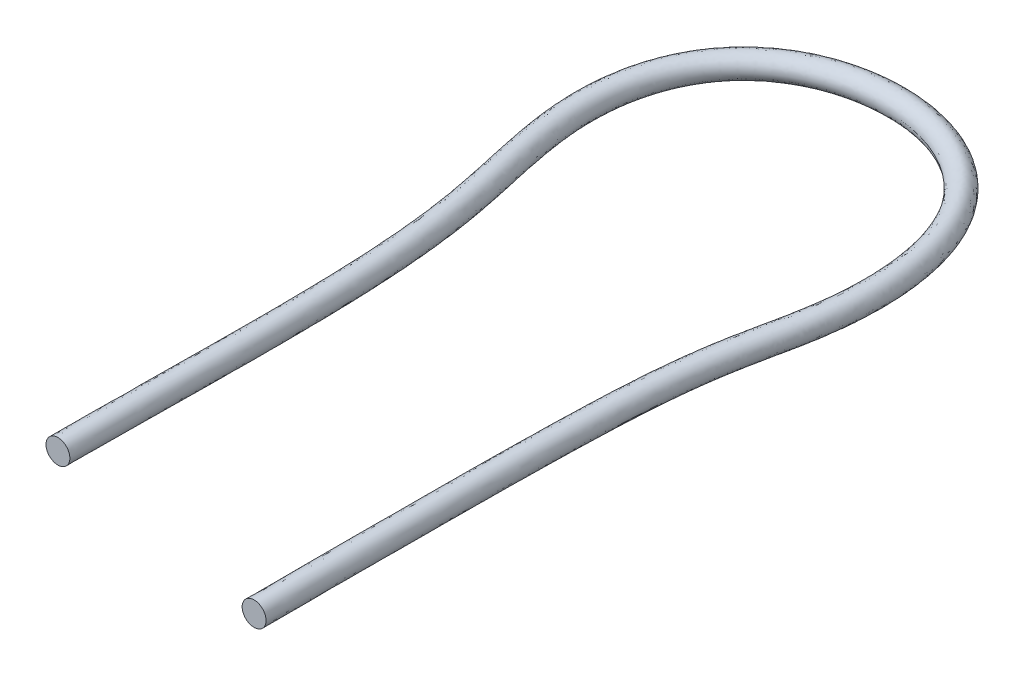
ISO-10303-21;
HEADER;
FILE_DESCRIPTION(('STEP AP214'),'2;1');
FILE_NAME('part.step','',(''),(''),'','','');
FILE_SCHEMA(('AUTOMOTIVE_DESIGN { 1 0 10303 214 1 1 1 1 }'));
ENDSEC;
DATA;
#1=APPLICATION_CONTEXT('core data for automotive mechanical design processes');
#2=APPLICATION_PROTOCOL_DEFINITION('international standard','automotive_design',2000,#1);
#3=PRODUCT_CONTEXT('',#1,'mechanical');
#4=PRODUCT('Part','Part','',(#3));
#5=PRODUCT_RELATED_PRODUCT_CATEGORY('part','',(#4));
#6=PRODUCT_DEFINITION_FORMATION('','',#4);
#7=PRODUCT_DEFINITION_CONTEXT('part definition',#1,'design');
#8=PRODUCT_DEFINITION('design','',#6,#7);
#9=PRODUCT_DEFINITION_SHAPE('','',#8);
#10=(LENGTH_UNIT() NAMED_UNIT(*) SI_UNIT(.MILLI.,.METRE.));
#11=(NAMED_UNIT(*) PLANE_ANGLE_UNIT() SI_UNIT($,.RADIAN.));
#12=(NAMED_UNIT(*) SI_UNIT($,.STERADIAN.) SOLID_ANGLE_UNIT());
#13=UNCERTAINTY_MEASURE_WITH_UNIT(LENGTH_MEASURE(1.E-05),#10,'distance_accuracy_value','');
#14=(GEOMETRIC_REPRESENTATION_CONTEXT(3) GLOBAL_UNCERTAINTY_ASSIGNED_CONTEXT((#13)) GLOBAL_UNIT_ASSIGNED_CONTEXT((#10,
#11,#12)) REPRESENTATION_CONTEXT('',''));
#15=CARTESIAN_POINT('',(0.,0.,0.));
#16=DIRECTION('',(0.,0.,1.));
#17=DIRECTION('',(1.,0.,0.));
#18=AXIS2_PLACEMENT_3D('',#15,#16,#17);
#19=CARTESIAN_POINT('',(0.,0.,0.));
#20=DIRECTION('',(0.,0.,1.));
#21=DIRECTION('',(1.,0.,0.));
#22=AXIS2_PLACEMENT_3D('',#19,#20,#21);
#23=PLANE('',#22);
#24=CARTESIAN_POINT('',(1.35098710010471,1.96404247382822E-07,0.));
#25=CARTESIAN_POINT('',(1.35099928413305,-0.0761665200162625,0.));
#26=CARTESIAN_POINT('',(1.344074112499,-0.152390199336861,0.));
#27=CARTESIAN_POINT('',(1.31741873550504,-0.302673851011979,0.));
#28=CARTESIAN_POINT('',(1.29765653922463,-0.376727933392834,0.));
#29=CARTESIAN_POINT('',(1.24645848200623,-0.520400145417849,0.));
#30=CARTESIAN_POINT('',(1.21505994685638,-0.590031633767595,0.));
#31=CARTESIAN_POINT('',(1.14143734353301,-0.723305068133596,0.));
#32=CARTESIAN_POINT('',(1.09922166495355,-0.786951603917261,0.));
#33=CARTESIAN_POINT('',(1.02758440520029,-0.877490887674194,0.));
#34=CARTESIAN_POINT('',(1.00179772976689,-0.907317680802031,0.));
#35=CARTESIAN_POINT('',(0.947658220601305,-0.964555548310392,0.));
#36=CARTESIAN_POINT('',(0.919305700549644,-0.991966917175691,0.));
#37=CARTESIAN_POINT('',(0.860182318544872,-1.04401135085076,0.));
#38=CARTESIAN_POINT('',(0.82941293765561,-1.06864609499499,0.));
#39=CARTESIAN_POINT('',(0.765716136219022,-1.11492808019237,0.));
#40=CARTESIAN_POINT('',(0.732788628743499,-1.1365752007964,0.));
#41=CARTESIAN_POINT('',(0.636493999470526,-1.19385628663197,0.));
#42=CARTESIAN_POINT('',(0.570918236945154,-1.22585096379896,0.));
#43=CARTESIAN_POINT('',(0.435530974968001,-1.27914859571307,0.));
#44=CARTESIAN_POINT('',(0.365713887904819,-1.30043708785731,0.));
#45=CARTESIAN_POINT('',(0.219353219383041,-1.33292795791501,0.));
#46=CARTESIAN_POINT('',(0.142656261752704,-1.34345741834728,0.));
#47=CARTESIAN_POINT('',(0.0272234662749047,-1.34958750423538,0.));
#48=CARTESIAN_POINT('',(-0.0113119422936278,-1.35002094808346,0.));
#49=CARTESIAN_POINT('',(-0.0882888618679696,-1.34760127351201,0.));
#50=CARTESIAN_POINT('',(-0.126730379590848,-1.34474839753818,0.));
#51=CARTESIAN_POINT('',(-0.203438663783841,-1.33566012733553,0.));
#52=CARTESIAN_POINT('',(-0.241703136765083,-1.3294052820221,0.));
#53=CARTESIAN_POINT('',(-0.317498780159154,-1.31341786117966,0.));
#54=CARTESIAN_POINT('',(-0.355029966593961,-1.30368536172563,0.));
#55=CARTESIAN_POINT('',(-0.429087925986064,-1.28090048703711,0.));
#56=CARTESIAN_POINT('',(-0.465614222245975,-1.26784656529133,0.));
#57=CARTESIAN_POINT('',(-0.537395351784267,-1.23863736423961,0.));
#58=CARTESIAN_POINT('',(-0.572650078331017,-1.2224818253098,0.));
#59=CARTESIAN_POINT('',(-0.672717801167074,-1.1714049060049,0.));
#60=CARTESIAN_POINT('',(-0.735629496001078,-1.13266426922994,0.));
#61=CARTESIAN_POINT('',(-0.854643483506827,-1.04587385293271,0.));
#62=CARTESIAN_POINT('',(-0.910741974396287,-0.99781891447826,0.));
#63=CARTESIAN_POINT('',(-1.01840626283315,-0.889672696062223,0.));
#64=CARTESIAN_POINT('',(-1.0693665644763,-0.828968713241499,0.));
#65=CARTESIAN_POINT('',(-1.13706488934229,-0.731966154861296,0.));
#66=CARTESIAN_POINT('',(-1.15817081187796,-0.698647732197779,0.));
#67=CARTESIAN_POINT('',(-1.19720799326092,-0.630203008487769,0.));
#68=CARTESIAN_POINT('',(-1.21513999283739,-0.595077131740842,0.));
#69=CARTESIAN_POINT('',(-1.26193518866379,-0.491602042092125,0.));
#70=CARTESIAN_POINT('',(-1.28649628695393,-0.421266337043056,0.));
#71=CARTESIAN_POINT('',(-1.32368283918677,-0.27750174627689,0.));
#72=CARTESIAN_POINT('',(-1.33629885568252,-0.204070462596971,0.));
#73=CARTESIAN_POINT('',(-1.3464056283475,-0.0928659527308167,0.));
#74=CARTESIAN_POINT('',(-1.34829296343418,-0.0554459596331201,0.));
#75=CARTESIAN_POINT('',(-1.34908210368954,0.0193754247597944,0.));
#76=CARTESIAN_POINT('',(-1.34798751615738,0.056776783835183,0.));
#77=CARTESIAN_POINT('',(-1.34022911032843,0.168689489718033,0.));
#78=CARTESIAN_POINT('',(-1.32909562088423,0.242964804204473,0.));
#79=CARTESIAN_POINT('',(-1.30298447934316,0.354109187614443,0.));
#80=CARTESIAN_POINT('',(-1.29231623984545,0.392053322124934,0.));
#81=CARTESIAN_POINT('',(-1.26765597855355,0.46685556777208,0.));
#82=CARTESIAN_POINT('',(-1.2536645677412,0.503713877144637,0.));
#83=CARTESIAN_POINT('',(-1.22234116743374,0.57596605623887,0.));
#84=CARTESIAN_POINT('',(-1.20501058877813,0.611360536801727,0.));
#85=CARTESIAN_POINT('',(-1.1671797779008,0.68040232627059,0.));
#86=CARTESIAN_POINT('',(-1.14667931404922,0.7140495072577,0.));
#87=CARTESIAN_POINT('',(-1.08376083084938,0.807719104267566,0.));
#88=CARTESIAN_POINT('',(-1.03773051916774,0.865362974183513,0.));
#89=CARTESIAN_POINT('',(-0.937157279356102,0.972711357206334,0.));
#90=CARTESIAN_POINT('',(-0.882603235603041,1.02240532929103,0.));
#91=CARTESIAN_POINT('',(-0.762976948502769,1.11535086198843,0.));
#92=CARTESIAN_POINT('',(-0.697477527491923,1.15805971721893,0.));
#93=CARTESIAN_POINT('',(-0.594636222597143,1.21329234373315,0.));
#94=CARTESIAN_POINT('',(-0.559599632908965,1.23022835389675,0.));
#95=CARTESIAN_POINT('',(-0.488174725722348,1.26098314389959,0.));
#96=CARTESIAN_POINT('',(-0.451786570505452,1.27480229657764,0.));
#97=CARTESIAN_POINT('',(-0.378369229066446,1.29895490145853,0.));
#98=CARTESIAN_POINT('',(-0.341353576533954,1.30932943086708,0.));
#99=CARTESIAN_POINT('',(-0.26652233995772,1.32661721559541,0.));
#100=CARTESIAN_POINT('',(-0.228706757760258,1.33353047890308,0.));
#101=CARTESIAN_POINT('',(-0.152590403996903,1.34395987245995,0.));
#102=CARTESIAN_POINT('',(-0.11428936720742,1.34747405676379,0.));
#103=CARTESIAN_POINT('',(-0.037535848025708,1.35118503605179,0.));
#104=CARTESIAN_POINT('',(0.000916644640933498,1.35138160196009,0.));
#105=CARTESIAN_POINT('',(0.11204508692799,1.34726613108592,0.));
#106=CARTESIAN_POINT('',(0.18460720224646,1.33876954216588,0.));
#107=CARTESIAN_POINT('',(0.327526593284278,1.31069317476766,0.));
#108=CARTESIAN_POINT('',(0.397882886069197,1.29110852739953,0.));
#109=CARTESIAN_POINT('',(0.540302934990082,1.23916693300475,0.));
#110=CARTESIAN_POINT('',(0.612045031153789,1.20590555490946,0.));
#111=CARTESIAN_POINT('',(0.714338333614083,1.14701313541189,0.));
#112=CARTESIAN_POINT('',(0.747546224886277,1.12588498466891,0.));
#113=CARTESIAN_POINT('',(0.811883689442075,1.0806741183461,0.));
#114=CARTESIAN_POINT('',(0.843013639379242,1.05659194047963,0.));
#115=CARTESIAN_POINT('',(0.929795488968784,0.982751318619446,0.));
#116=CARTESIAN_POINT('',(0.982393344836369,0.929339564763248,0.));
#117=CARTESIAN_POINT('',(1.07812048705414,0.814574417858545,0.));
#118=CARTESIAN_POINT('',(1.1212352942273,0.75320910485345,0.));
#119=CARTESIAN_POINT('',(1.19759562387719,0.623672844167406,0.));
#120=CARTESIAN_POINT('',(1.23072250973091,0.555432026639248,0.));
#121=CARTESIAN_POINT('',(1.28553298306528,0.414593155221956,0.));
#122=CARTESIAN_POINT('',(1.30723633389997,0.342002870188013,0.));
#123=CARTESIAN_POINT('',(1.33200980689864,0.224081504146302,0.));
#124=CARTESIAN_POINT('',(1.33906440971004,0.179557272547904,0.));
#125=CARTESIAN_POINT('',(1.3485485726401,0.0900286010506202,0.));
#126=CARTESIAN_POINT('',(1.35097989780427,0.0450243510115035,0.));
#127=CARTESIAN_POINT('',(1.35098710010471,1.96404247382822E-07,0.));
#128=B_SPLINE_CURVE_WITH_KNOTS('',3,(#24,#25,#26,#27,#28,#29,#30,#31,#32,#33,#34,#35,#36,#37,
#38,#39,#40,#41,#42,#43,#44,#45,#46,#47,#48,#49,#50,#51,#52,#53,#54,#55,#56,#57,#58,#59,#60,#61,
#62,#63,#64,#65,#66,#67,#68,#69,#70,#71,#72,#73,#74,#75,#76,#77,#78,#79,#80,#81,#82,#83,#84,#85,
#86,#87,#88,#89,#90,#91,#92,#93,#94,#95,#96,#97,#98,#99,#100,#101,#102,#103,#104,#105,#106,#107,
#108,#109,#110,#111,#112,#113,#114,#115,#116,#117,#118,#119,#120,#121,#122,#123,#124,#125,#126,
#127),.UNSPECIFIED.,.T.,.F.,(4,2,2,2,2,2,2,2,2,2,2,2,2,2,2,2,2,2,2,2,2,2,2,2,2,2,2,2,2,2,2,2,2,
2,2,2,2,2,2,2,2,2,2,2,2,2,2,2,2,2,2,4),(0.,0.228335747141374,0.457242720191214,
0.685421697455897,0.913424235809351,1.0315790428782,1.14971942470782,1.26778796605593,
1.38586126606857,1.60371479377741,1.82186182681172,2.05294411636614,2.16844500868064,
2.28393738055188,2.4000971410733,2.51625436071202,2.63246576443929,2.74868689999926,
2.96932648965598,3.19008863646075,3.42654047263579,3.54472171289959,3.6628753355894,
3.88520437482614,4.10770892328014,4.22000485097235,4.33216499208749,4.55632036450323,
4.67444651617215,4.79255096653997,4.91060562531882,5.0286689146689,5.24892167417752,
5.469464095703,5.70283183207177,5.81945818290032,5.93607057546547,6.0512377404041,
6.16640463955963,6.28163743188262,6.39687818080026,6.61506730211288,6.83335230709072,
7.06928133818111,7.18722087085101,7.3051389670846,7.52884011520056,7.75288048585349,
7.97948572364939,8.20569762231183,8.34072446375077,8.475699745144),.UNSPECIFIED.);
#129=CARTESIAN_POINT('',(1.35098710010471,1.96404247382822E-07,0.));
#130=VERTEX_POINT('',#129);
#131=EDGE_CURVE('E22',#130,#130,#128,.T.);
#132=ORIENTED_EDGE('',*,*,#131,.F.);
#133=EDGE_LOOP('',(#132));
#134=FACE_BOUND('',#133,.T.);
#135=ADVANCED_FACE('F15',(#134),#23,.T.);
#136=CARTESIAN_POINT('',(27.,0.,4.80621192690123));
#137=DIRECTION('',(0.,0.,-1.));
#138=DIRECTION('',(-1.,0.,0.));
#139=AXIS2_PLACEMENT_3D('',#136,#137,#138);
#140=PLANE('',#139);
#141=CARTESIAN_POINT('',(25.6490128998951,1.96404247382822E-07,4.8062119269012));
#142=CARTESIAN_POINT('',(25.6490310916167,0.0760096669256623,4.80621192690119));
#143=CARTESIAN_POINT('',(25.6559584808471,0.152073013553381,4.80621192690123));
#144=CARTESIAN_POINT('',(25.6825998074527,0.302032717457189,4.80621192690123));
#145=CARTESIAN_POINT('',(25.7023449171346,0.375923331567917,4.8062119269012));
#146=CARTESIAN_POINT('',(25.7534933145616,0.51926888387716,4.8062119269012));
#147=CARTESIAN_POINT('',(25.7848593823699,0.588737162562841,4.80621192690123));
#148=CARTESIAN_POINT('',(25.8583803873003,0.721698252225705,4.80621192690123));
#149=CARTESIAN_POINT('',(25.900527291278,0.78519546446237,4.8062119269012));
#150=CARTESIAN_POINT('',(25.9720340926442,0.875583652835084,4.80621192690121));
#151=CARTESIAN_POINT('',(25.9977873244021,0.905386099630092,4.80621192690123));
#152=CARTESIAN_POINT('',(26.0518426123432,0.962594062648999,4.80621192690124));
#153=CARTESIAN_POINT('',(26.0801443772195,0.989999852115738,4.80621192690123));
#154=CARTESIAN_POINT('',(26.1391462953624,1.04206547268356,4.80621192690123));
#155=CARTESIAN_POINT('',(26.1698451151574,1.06672681225067,4.80621192690123));
#156=CARTESIAN_POINT('',(26.2333837254156,1.11309873578892,4.80621192690123));
#157=CARTESIAN_POINT('',(26.2662236064603,1.13480919479746,4.80621192690123));
#158=CARTESIAN_POINT('',(26.3627528993106,1.19262245596736,4.80621192690122));
#159=CARTESIAN_POINT('',(26.4286889584514,1.22504958114553,4.80621192690123));
#160=CARTESIAN_POINT('',(26.5648654634794,1.27914589561617,4.80621192690123));
#161=CARTESIAN_POINT('',(26.6351117006421,1.3008002382684,4.80621192690123));
#162=CARTESIAN_POINT('',(26.7823706454491,1.33389682185152,4.80621192690123));
#163=CARTESIAN_POINT('',(26.8595387167118,1.34466689408763,4.80621192690123));
#164=CARTESIAN_POINT('',(26.9756955429293,1.35098144210065,4.80621192690123));
#165=CARTESIAN_POINT('',(27.014473149443,1.35144720141041,4.80621192690123));
#166=CARTESIAN_POINT('',(27.091932443632,1.34902017307044,4.80621192690123));
#167=CARTESIAN_POINT('',(27.1306141399608,1.34612770035049,4.80621192690123));
#168=CARTESIAN_POINT('',(27.2073509035398,1.3369268434792,4.80621192690123));
#169=CARTESIAN_POINT('',(27.2454082687886,1.33063771369071,4.80621192690123));
#170=CARTESIAN_POINT('',(27.3207783134108,1.31456624632564,4.80621192690123));
#171=CARTESIAN_POINT('',(27.3580910128585,1.30478400304886,4.80621192690123));
#172=CARTESIAN_POINT('',(27.4316982552404,1.28189410695894,4.80621192690123));
#173=CARTESIAN_POINT('',(27.4679923294074,1.2687849501035,4.80621192690123));
#174=CARTESIAN_POINT('',(27.5392961689603,1.23946594349148,4.80621192690123));
#175=CARTESIAN_POINT('',(27.5743058248294,1.22325583005835,4.80621192690123));
#176=CARTESIAN_POINT('',(27.6731366525951,1.17229879314828,4.80621192690123));
#177=CARTESIAN_POINT('',(27.7350834465837,1.13382830900856,4.80621192690123));
#178=CARTESIAN_POINT('',(27.8522938106196,1.04781452903272,4.80621192690123));
#179=CARTESIAN_POINT('',(27.9075536458451,1.00026620087433,4.80621192690123));
#180=CARTESIAN_POINT('',(28.0142802259861,0.892898039628792,4.80621192690123));
#181=CARTESIAN_POINT('',(28.0650683448158,0.832393047541259,4.80621192690123));
#182=CARTESIAN_POINT('',(28.1326887035602,0.735791773365219,4.80621192690123));
#183=CARTESIAN_POINT('',(28.1537997010541,0.702621998780522,4.80621192690123));
#184=CARTESIAN_POINT('',(28.1929269816526,0.634507218018846,4.80621192690123));
#185=CARTESIAN_POINT('',(28.2109439329851,0.599562597277077,4.80621192690123));
#186=CARTESIAN_POINT('',(28.258590903843,0.495559045700699,4.80621192690123));
#187=CARTESIAN_POINT('',(28.2838317596035,0.4244455810599,4.80621192690123));
#188=CARTESIAN_POINT('',(28.3222151569606,0.279019383845597,4.80621192690123));
#189=CARTESIAN_POINT('',(28.3353487716641,0.204704332873248,4.80621192690123));
#190=CARTESIAN_POINT('',(28.3460435011613,0.0921837539038651,4.80621192690123));
#191=CARTESIAN_POINT('',(28.3480980467719,0.0543587413367732,4.80621192690123));
#192=CARTESIAN_POINT('',(28.3491574529029,-0.0212834349510286,4.80621192690123));
#193=CARTESIAN_POINT('',(28.3481659621983,-0.0591005538369505,4.80621192690123));
#194=CARTESIAN_POINT('',(28.3406006042982,-0.17225972599138,4.80621192690123));
#195=CARTESIAN_POINT('',(28.3294419966448,-0.247374518923354,4.80621192690123));
#196=CARTESIAN_POINT('',(28.3031086363308,-0.359187874747676,4.80621192690123));
#197=CARTESIAN_POINT('',(28.2924357003579,-0.397012631079278,4.80621192690123));
#198=CARTESIAN_POINT('',(28.2677375396411,-0.471561233730864,4.80621192690123));
#199=CARTESIAN_POINT('',(28.2537130013909,-0.508285303768222,4.80621192690123));
#200=CARTESIAN_POINT('',(28.2222884231738,-0.580240410836423,4.80621192690123));
#201=CARTESIAN_POINT('',(28.2048900117672,-0.615472158250492,4.80621192690123));
#202=CARTESIAN_POINT('',(28.166903869564,-0.684161626498545,4.80621192690123));
#203=CARTESIAN_POINT('',(28.1463158771374,-0.717619201501017,4.80621192690123));
#204=CARTESIAN_POINT('',(28.083624099987,-0.809989012762379,4.80621192690123));
#205=CARTESIAN_POINT('',(28.0380190061137,-0.866569643807972,4.80621192690123));
#206=CARTESIAN_POINT('',(27.9385290269561,-0.971943652174595,4.80621192690123));
#207=CARTESIAN_POINT('',(27.8846334150817,-1.02072677161844,4.80621192690123));
#208=CARTESIAN_POINT('',(27.7660892473747,-1.11247297480754,4.80621192690123));
#209=CARTESIAN_POINT('',(27.7009613790715,-1.15482430748371,4.80621192690123));
#210=CARTESIAN_POINT('',(27.598775483529,-1.20971708455336,4.80621192690123));
#211=CARTESIAN_POINT('',(27.5639711839238,-1.22657337819676,4.80621192690123));
#212=CARTESIAN_POINT('',(27.4930392705512,-1.25724869251104,4.80621192690123));
#213=CARTESIAN_POINT('',(27.456911780398,-1.27106799606153,4.80621192690123));
#214=CARTESIAN_POINT('',(27.3834795165454,-1.29550079037458,4.80621192690123));
#215=CARTESIAN_POINT('',(27.3461718605326,-1.30610563470809,4.80621192690123));
#216=CARTESIAN_POINT('',(27.2707405736359,-1.32384832990053,4.80621192690123));
#217=CARTESIAN_POINT('',(27.2326169443932,-1.33098618773172,4.80621192690123));
#218=CARTESIAN_POINT('',(27.1558667760142,-1.34184259890739,4.80621192690123));
#219=CARTESIAN_POINT('',(27.1172399754072,-1.34555929620208,4.80621192690123));
#220=CARTESIAN_POINT('',(27.0398187898485,-1.34964544204758,4.80621192690123));
#221=CARTESIAN_POINT('',(27.0010243935924,-1.35001466116523,4.80621192690123));
#222=CARTESIAN_POINT('',(26.8886714572344,-1.34633284963424,4.80621192690123));
#223=CARTESIAN_POINT('',(26.8152095871757,-1.33801019750407,4.80621192690123));
#224=CARTESIAN_POINT('',(26.6705106651554,-1.31000418532802,4.80621192690123));
#225=CARTESIAN_POINT('',(26.5992745494728,-1.29031611039522,4.80621192690123));
#226=CARTESIAN_POINT('',(26.4560119332881,-1.23813469511415,4.80621192690123));
#227=CARTESIAN_POINT('',(26.384263167647,-1.20485926641245,4.80621192690123));
#228=CARTESIAN_POINT('',(26.2820254880633,-1.14586048798767,4.80621192690123));
#229=CARTESIAN_POINT('',(26.2488485452187,-1.12468392534084,4.80621192690123));
#230=CARTESIAN_POINT('',(26.1845996306126,-1.07934613804822,4.80621192690123));
#231=CARTESIAN_POINT('',(26.1535274171278,-1.05518525704732,4.80621192690122));
#232=CARTESIAN_POINT('',(26.0674712736605,-0.981545237888372,4.80621192690122));
#233=CARTESIAN_POINT('',(26.0154960907648,-0.928489923190905,4.80621192690123));
#234=CARTESIAN_POINT('',(25.9208807832594,-0.814580472507023,4.80621192690123));
#235=CARTESIAN_POINT('',(25.8782553567935,-0.753714292268568,4.8062119269012));
#236=CARTESIAN_POINT('',(25.8024812713937,-0.624950452105059,4.80621192690121));
#237=CARTESIAN_POINT('',(25.7695059463929,-0.556950888168026,4.80621192690124));
#238=CARTESIAN_POINT('',(25.7148532822663,-0.416570175825604,4.80621192690122));
#239=CARTESIAN_POINT('',(25.6931676973267,-0.344192268529782,4.80621192690118));
#240=CARTESIAN_POINT('',(25.6682243699299,-0.22609828616854,4.8062119269012));
#241=CARTESIAN_POINT('',(25.6610697462479,-0.181176646834153,4.80621192690123));
#242=CARTESIAN_POINT('',(25.6514594651112,-0.0908428936334838,4.80621192690123));
#243=CARTESIAN_POINT('',(25.6490020266294,-0.0454309722377617,4.80621192690121));
#244=CARTESIAN_POINT('',(25.6490128998951,1.96404247382822E-07,4.8062119269012));
#245=B_SPLINE_CURVE_WITH_KNOTS('',3,(#141,#142,#143,#144,#145,#146,#147,#148,#149,#150,#151,
#152,#153,#154,#155,#156,#157,#158,#159,#160,#161,#162,#163,#164,#165,#166,#167,#168,#169,#170,
#171,#172,#173,#174,#175,#176,#177,#178,#179,#180,#181,#182,#183,#184,#185,#186,#187,#188,#189,
#190,#191,#192,#193,#194,#195,#196,#197,#198,#199,#200,#201,#202,#203,#204,#205,#206,#207,#208,
#209,#210,#211,#212,#213,#214,#215,#216,#217,#218,#219,#220,#221,#222,#223,#224,#225,#226,#227,
#228,#229,#230,#231,#232,#233,#234,#235,#236,#237,#238,#239,#240,#241,#242,#243,#244),
.UNSPECIFIED.,.T.,.F.,(4,2,2,2,2,2,2,2,2,2,2,2,2,2,2,2,2,2,2,2,2,2,2,2,2,2,2,2,2,2,2,2,2,2,2,2,
2,2,2,2,2,2,2,2,2,2,2,2,2,2,2,4),(0.,0.227862848263208,0.456281938675764,0.683975678709412,
0.911500248619596,1.02953579656502,1.14755786968853,1.26551474909696,1.38347662213643,
1.60286533072648,1.82255556066755,2.05510894366008,2.17133323673229,2.28754663135061,
2.40310806654888,2.51866638229558,2.63427703338684,2.74989751930684,2.96767495375723,
3.18557346598796,3.42127220125251,3.53909144405155,3.65688520908295,3.88207800572412,
4.10743670869172,4.22096869896585,4.33436474500428,4.56096332443142,4.6787465321178,
4.79650563543793,4.91420803758629,5.03192009956081,5.24891395356987,5.46619096139169,
5.6980750912069,5.81397536359762,5.92986483590956,6.04606332293782,6.16226157628486,
6.27852283247769,6.39479205705266,6.61557390579775,6.83644741063857,7.07239197993561,
7.1903278630587,7.30825017847813,7.52990095314295,7.75189771226813,7.97766659038434,
8.20327033899697,8.33951655766317,8.47571110573304),.UNSPECIFIED.);
#246=CARTESIAN_POINT('',(25.6490128998951,1.96404247382822E-07,4.8062119269012));
#247=VERTEX_POINT('',#246);
#248=EDGE_CURVE('E10',#247,#247,#245,.T.);
#249=ORIENTED_EDGE('',*,*,#248,.F.);
#250=EDGE_LOOP('',(#249));
#251=FACE_BOUND('',#250,.T.);
#252=ADVANCED_FACE('F36',(#251),#140,.F.);
#253=CARTESIAN_POINT('',(1.35098712339463,-0.000186764345551631,0.));
#254=CARTESIAN_POINT('',(1.35098712339463,-0.000186764345551631,-4.84270709144785));
#255=CARTESIAN_POINT('',(1.47786088297692,-0.000186764345551631,-14.1794830064112));
#256=CARTESIAN_POINT('',(1.58193377158335,-0.000186764345551631,-26.3674910993353));
#257=CARTESIAN_POINT('',(1.31952752822296,-0.000186764345551631,-36.3596255541261));
#258=CARTESIAN_POINT('',(0.357848237223821,-0.000186764345551631,-46.7895152418183));
#259=CARTESIAN_POINT('',(-1.75716946678794,-0.000186764345551632,-55.2824318096049));
#260=CARTESIAN_POINT('',(-2.94020844999405,-0.000186764345551631,-62.2975754419758));
#261=CARTESIAN_POINT('',(-2.49611525312067,-0.000186764345551631,-67.0777910133066));
#262=CARTESIAN_POINT('',(-1.60505484066426,-0.000186764345551631,-70.7543839365625));
#263=CARTESIAN_POINT('',(0.211957974263065,-0.000186764345551631,-74.5931764181462));
#264=CARTESIAN_POINT('',(4.51461143016742,-0.000186764345551631,-78.4009958570542));
#265=CARTESIAN_POINT('',(10.4672199548498,-0.000186764345551631,-80.4302398279857));
#266=CARTESIAN_POINT('',(17.1063732601853,-0.000186764345551631,-80.2354727814003));
#267=CARTESIAN_POINT('',(22.8200189232497,-0.000186764345551631,-77.7651899750285));
#268=CARTESIAN_POINT('',(26.8266892118166,-0.000186764345551631,-73.3851932844623));
#269=CARTESIAN_POINT('',(28.9647759369274,-0.000186764345551631,-67.57077644598));
#270=CARTESIAN_POINT('',(29.3921976783929,-0.000186764345551631,-62.4449884825942));
#271=CARTESIAN_POINT('',(29.2281477347646,-0.000186764345551631,-58.7215240966603));
#272=CARTESIAN_POINT('',(28.8060614816325,-0.000186764345551631,-55.2107104563111));
#273=CARTESIAN_POINT('',(27.9515338355809,-0.000186764345551631,-51.1590937045288));
#274=CARTESIAN_POINT('',(26.9177999334012,-0.000186764345551631,-46.108641440211));
#275=CARTESIAN_POINT('',(26.2066416257915,-0.000186764345551631,-39.5883422871592));
#276=CARTESIAN_POINT('',(25.8108618602266,-0.000186764345551631,-30.8487597312597));
#277=CARTESIAN_POINT('',(25.650984138006,-0.000186764345551631,-17.3744761813685));
#278=CARTESIAN_POINT('',(25.6490128766052,-0.000186764345551631,-3.68038923042557));
#279=CARTESIAN_POINT('',(25.6490128766052,-0.000186764345551631,4.80621192690121));
#280=CARTESIAN_POINT('',(1.35100733910881,-0.403131527846783,0.));
#281=CARTESIAN_POINT('',(1.35100733910881,-0.403131527846783,-4.84270640408459));
#282=CARTESIAN_POINT('',(1.47788109117633,-0.403131527846783,-14.1794821906307));
#283=CARTESIAN_POINT('',(1.5819540206558,-0.403131527846783,-26.3674908146088));
#284=CARTESIAN_POINT('',(1.31954779790549,-0.403131527846783,-36.3596257549731));
#285=CARTESIAN_POINT('',(0.357868323017967,-0.403131527846783,-46.7895204936321));
#286=CARTESIAN_POINT('',(-1.75715076055081,-0.403131527846783,-55.2824373670119));
#287=CARTESIAN_POINT('',(-2.940187023609,-0.403131527846783,-62.2975793949545));
#288=CARTESIAN_POINT('',(-2.49609433121957,-0.403131527846783,-67.0777906844116));
#289=CARTESIAN_POINT('',(-1.60503512632179,-0.403131527846783,-70.7543743129737));
#290=CARTESIAN_POINT('',(0.211975564492574,-0.403131527846783,-74.5931632383591));
#291=CARTESIAN_POINT('',(4.51462061314029,-0.403131527846784,-78.4009754456464));
#292=CARTESIAN_POINT('',(10.4672258401551,-0.403131527846783,-80.430217788308));
#293=CARTESIAN_POINT('',(17.106368791185,-0.403131527846784,-80.235452112698));
#294=CARTESIAN_POINT('',(22.8200052078282,-0.403131527846783,-77.7651703796241));
#295=CARTESIAN_POINT('',(26.8266710448197,-0.403131527846783,-73.3851822001527));
#296=CARTESIAN_POINT('',(28.9647529513008,-0.403131527846783,-67.570776831786));
#297=CARTESIAN_POINT('',(29.392177679449,-0.403131527846783,-62.4449860347405));
#298=CARTESIAN_POINT('',(29.2281272487955,-0.403131527846783,-58.7215266319993));
#299=CARTESIAN_POINT('',(28.8060417715033,-0.403131527846783,-55.2107153704305));
#300=CARTESIAN_POINT('',(27.9515142991569,-0.403131527846783,-51.1590991232137));
#301=CARTESIAN_POINT('',(26.9177798900468,-0.403131527846783,-46.1086447719862));
#302=CARTESIAN_POINT('',(26.2066213313037,-0.403131527846783,-39.5883430996156));
#303=CARTESIAN_POINT('',(25.8108416262142,-0.403131527846783,-30.848759766305));
#304=CARTESIAN_POINT('',(25.6509639090183,-0.403131527846783,-17.3744759071286));
#305=CARTESIAN_POINT('',(25.6489926608911,-0.403131527846783,-3.68038923042557));
#306=CARTESIAN_POINT('',(25.6489926608911,-0.403131527846783,4.80621192690121));
#307=CARTESIAN_POINT('',(0.963361912297706,-1.21027461114244,0.));
#308=CARTESIAN_POINT('',(0.963361912297706,-1.21027461114244,-4.84621761988473));
#309=CARTESIAN_POINT('',(1.09025694349739,-1.21027461114244,-14.1858772132164));
#310=CARTESIAN_POINT('',(1.19432223391776,-1.21027461114244,-26.3662508811314));
#311=CARTESIAN_POINT('',(0.931994443459219,-1.21027461114244,-36.3410253523427));
#312=CARTESIAN_POINT('',(-0.0258407712830158,-1.21027461114244,-46.7271335575025));
#313=CARTESIAN_POINT('',(-2.13043810477328,-1.21027461114244,-55.1764930304497));
#314=CARTESIAN_POINT('',(-3.33184475520374,-1.21027461114244,-62.2727746286067));
#315=CARTESIAN_POINT('',(-2.88083646695595,-1.21027461114244,-67.1359031872859));
#316=CARTESIAN_POINT('',(-1.97161601461361,-1.21027461114244,-70.8889418685165));
#317=CARTESIAN_POINT('',(-0.108432236580629,-1.21027461114244,-74.8312137870685));
#318=CARTESIAN_POINT('',(4.32071609130903,-1.21027461114244,-78.7491901108742));
#319=CARTESIAN_POINT('',(10.4122981464491,-1.21027461114244,-80.8211181305889));
#320=CARTESIAN_POINT('',(17.1851492907191,-1.21027461114244,-80.623961703094));
#321=CARTESIAN_POINT('',(23.049563607649,-1.21027461114244,-78.0936178226423));
#322=CARTESIAN_POINT('',(27.1710511305023,-1.21027461114244,-73.5848383969439));
#323=CARTESIAN_POINT('',(29.3490895231618,-1.21027461114244,-67.6461111061465));
#324=CARTESIAN_POINT('',(29.7806088072847,-1.21027461114244,-62.4557307701372));
#325=CARTESIAN_POINT('',(29.6148680741861,-1.21027461114244,-58.6890580493058));
#326=CARTESIAN_POINT('',(29.1882470249019,-1.21027461114244,-55.1435983981414));
#327=CARTESIAN_POINT('',(28.328924126385,-1.21027461114244,-51.070468110889));
#328=CARTESIAN_POINT('',(27.3015529098761,-1.21027461114244,-46.0497498874559));
#329=CARTESIAN_POINT('',(26.5937248995686,-1.21027461114244,-39.5632499519423));
#330=CARTESIAN_POINT('',(26.1984221254151,-1.21027461114244,-30.8406543779356));
#331=CARTESIAN_POINT('',(26.0386268747444,-1.21027461114244,-17.3736273484489));
#332=CARTESIAN_POINT('',(26.0366380877023,-1.21027461114244,-3.68038923042554));
#333=CARTESIAN_POINT('',(26.0366380877023,-1.21027461114244,4.80621192690123));
#334=CARTESIAN_POINT('',(-0.34316523086278,-1.50478214732552,0.));
#335=CARTESIAN_POINT('',(-0.34316523086278,-1.50478214732552,-4.85808344621452));
#336=CARTESIAN_POINT('',(-0.216198079198815,-1.50478214732552,-14.2074612986726));
#337=CARTESIAN_POINT('',(-0.11216106891105,-1.50478214732552,-26.3620936552227));
#338=CARTESIAN_POINT('',(-0.374226055750996,-1.50478214732552,-36.2783823616007));
#339=CARTESIAN_POINT('',(-1.31910554507256,-1.50478214732552,-46.5167384261741));
#340=CARTESIAN_POINT('',(-3.38852489482309,-1.50478214732552,-54.8194142978578));
#341=CARTESIAN_POINT('',(-4.65195772228965,-1.50478214732552,-62.1890057439097));
#342=CARTESIAN_POINT('',(-4.17763198227268,-1.50478214732552,-67.3315975181034));
#343=CARTESIAN_POINT('',(-3.20718423222164,-1.50478214732552,-71.3426538891694));
#344=CARTESIAN_POINT('',(-1.1883956115782,-1.50478214732552,-75.6335915624111));
#345=CARTESIAN_POINT('',(3.66723494668028,-1.50478214732552,-79.922960056751));
#346=CARTESIAN_POINT('',(10.226979782683,-1.50478214732552,-82.1387192372205));
#347=CARTESIAN_POINT('',(17.4506950779825,-1.50478214732552,-81.9334269706462));
#348=CARTESIAN_POINT('',(23.8233805354451,-1.50478214732552,-79.200777413929));
#349=CARTESIAN_POINT('',(28.3317689788795,-1.50478214732552,-74.2578053214938));
#350=CARTESIAN_POINT('',(30.6446486110719,-1.50478214732552,-67.899749060199));
#351=CARTESIAN_POINT('',(31.0897679591236,-1.50478214732552,-62.4920631598789));
#352=CARTESIAN_POINT('',(30.9183662003358,-1.50478214732552,-58.5795726449906));
#353=CARTESIAN_POINT('',(30.4764246219408,-1.50478214732552,-54.9172976430345));
#354=CARTESIAN_POINT('',(29.6009439128959,-1.50478214732552,-50.7716946895075));
#355=CARTESIAN_POINT('',(28.5950302744567,-1.50478214732552,-45.8512332068138));
#356=CARTESIAN_POINT('',(27.8984324520058,-1.50478214732552,-39.478706608249));
#357=CARTESIAN_POINT('',(27.5047317925934,-1.50478214732552,-30.8133600937526));
#358=CARTESIAN_POINT('',(27.3452139049187,-1.50478214732552,-17.3707872853961));
#359=CARTESIAN_POINT('',(27.3431652308628,-1.50478214732552,-3.68038923042555));
#360=CARTESIAN_POINT('',(27.3431652308628,-1.50478214732552,4.80621192690123));
#361=CARTESIAN_POINT('',(-1.39430878849843,-0.671389049064244,0.));
#362=CARTESIAN_POINT('',(-1.39430878849843,-0.671389049064244,-4.86759840633747));
#363=CARTESIAN_POINT('',(-1.26728401347457,-0.671389049064244,-14.2247962860712));
#364=CARTESIAN_POINT('',(-1.16326722845123,-0.671389049064244,-26.358727217861));
#365=CARTESIAN_POINT('',(-1.4251192390815,-0.671389049064244,-36.2279360167264));
#366=CARTESIAN_POINT('',(-2.35957439037269,-0.671389049064244,-46.347593469054));
#367=CARTESIAN_POINT('',(-4.40074410795875,-0.671389049064245,-54.5321348734261));
#368=CARTESIAN_POINT('',(-5.71396899302827,-0.671389049064244,-62.1217769924288));
#369=CARTESIAN_POINT('',(-5.22089258540921,-0.671389049064244,-67.4892086466312));
#370=CARTESIAN_POINT('',(-4.20120174511351,-0.671389049064244,-71.7075172607249));
#371=CARTESIAN_POINT('',(-2.05720625054391,-0.671389049064244,-76.2790827749156));
#372=CARTESIAN_POINT('',(3.14143011208481,-0.671389049064244,-80.8671555303056));
#373=CARTESIAN_POINT('',(10.0780737391054,-0.671389049064244,-83.1986688778321));
#374=CARTESIAN_POINT('',(17.6643127821735,-0.671389049064244,-82.9869088763925));
#375=CARTESIAN_POINT('',(24.4458325253617,-0.671389049064244,-80.0913692773857));
#376=CARTESIAN_POINT('',(29.2655912594682,-0.671389049064244,-74.7991871174322));
#377=CARTESIAN_POINT('',(31.6867842996872,-0.671389049064244,-68.1040784128202));
#378=CARTESIAN_POINT('',(32.1430451454898,-0.671389049064244,-62.5211759021012));
#379=CARTESIAN_POINT('',(31.9670529966962,-0.671389049064244,-58.491540654546));
#380=CARTESIAN_POINT('',(31.5128192262264,-0.671389049064244,-54.7353196098683));
#381=CARTESIAN_POINT('',(30.6243342648498,-0.671389049064244,-50.5313714938246));
#382=CARTESIAN_POINT('',(29.6356730138101,-0.671389049064245,-45.691536342468));
#383=CARTESIAN_POINT('',(28.9481054072833,-0.671389049064244,-39.4106577629697));
#384=CARTESIAN_POINT('',(28.5556990298932,-0.671389049064245,-30.7913767520345));
#385=CARTESIAN_POINT('',(28.3964048719849,-0.671389049064244,-17.3684824773947));
#386=CARTESIAN_POINT('',(28.3943087884984,-0.671389049064244,-3.68038923042554));
#387=CARTESIAN_POINT('',(28.3943087884984,-0.671389049064244,4.80621192690123));
#388=CARTESIAN_POINT('',(-1.39060482969498,0.669774273399577,0.));
#389=CARTESIAN_POINT('',(-1.39060482969498,0.669774273399577,-4.86759349160298));
#390=CARTESIAN_POINT('',(-1.26357989426964,0.669774273399578,-14.224762568713));
#391=CARTESIAN_POINT('',(-1.15956533468663,0.669774273399577,-26.3587589061732));
#392=CARTESIAN_POINT('',(-1.42141949739378,0.669774273399577,-36.2281574223691));
#393=CARTESIAN_POINT('',(-2.35591232274351,0.669774273399578,-46.3480760980648));
#394=CARTESIAN_POINT('',(-4.39713414291044,0.669774273399577,-54.5331453330301));
#395=CARTESIAN_POINT('',(-5.71028356466013,0.669774273399578,-62.1218629827116));
#396=CARTESIAN_POINT('',(-5.21726506770282,0.669774273399577,-67.4884999609694));
#397=CARTESIAN_POINT('',(-4.19773296832657,0.669774273399578,-71.7063794458045));
#398=CARTESIAN_POINT('',(-2.05419477534132,0.669774273399578,-76.2768516651969));
#399=CARTESIAN_POINT('',(3.14333563676604,0.669774273399578,-80.8639562177458));
#400=CARTESIAN_POINT('',(10.0784270308019,0.669774273399577,-83.195027756289));
#401=CARTESIAN_POINT('',(17.6635805102751,0.669774273399577,-82.9832198251296));
#402=CARTESIAN_POINT('',(24.4437381242874,0.669774273399578,-80.0883710420659));
#403=CARTESIAN_POINT('',(29.2623124890559,0.669774273399577,-74.7973175732236));
#404=CARTESIAN_POINT('',(31.6832790508216,0.669774273399578,-68.1031135859396));
#405=CARTESIAN_POINT('',(32.1393190427796,0.669774273399577,-62.521180422167));
#406=CARTESIAN_POINT('',(31.9633757072439,0.669774273399577,-58.4918030720391));
#407=CARTESIAN_POINT('',(31.5091546485023,0.669774273399577,-54.735880618794));
#408=CARTESIAN_POINT('',(30.620719844678,0.669774273399578,-50.5321731295636));
#409=CARTESIAN_POINT('',(29.6320077360363,0.669774273399577,-45.6920842964535));
#410=CARTESIAN_POINT('',(28.9444127039354,0.669774273399578,-39.4109257033519));
#411=CARTESIAN_POINT('',(28.551996922847,0.669774273399577,-30.7914762126594));
#412=CARTESIAN_POINT('',(28.3927014474164,0.669774273399578,-17.3685086715842));
#413=CARTESIAN_POINT('',(28.390604829695,0.669774273399577,-3.68038923042555));
#414=CARTESIAN_POINT('',(28.390604829695,0.669774273399577,4.80621192690123));
#415=CARTESIAN_POINT('',(-0.344478957278443,1.50872165839619,0.));
#416=CARTESIAN_POINT('',(-0.344478957278443,1.50872165839619,-4.85808438352287));
#417=CARTESIAN_POINT('',(-0.217511872742018,1.50872165839619,-14.2074724868607));
#418=CARTESIAN_POINT('',(-0.113474008447856,1.50872165839619,-26.3620818575921));
#419=CARTESIAN_POINT('',(-0.375538192511408,1.50872165839619,-36.2783026038524));
#420=CARTESIAN_POINT('',(-1.32040429302116,1.50872165839618,-46.5165704400756));
#421=CARTESIAN_POINT('',(-3.38980649906918,1.50872165839619,-54.8190559581173));
#422=CARTESIAN_POINT('',(-4.65326327589359,1.50872165839619,-62.1889794947895));
#423=CARTESIAN_POINT('',(-4.17891722589115,1.50872165839619,-67.3318531935419));
#424=CARTESIAN_POINT('',(-3.20841358957017,1.50872165839619,-71.3430532867757));
#425=CARTESIAN_POINT('',(-1.18946231885259,1.50872165839619,-75.6343816729269));
#426=CARTESIAN_POINT('',(3.66655760704614,1.50872165839619,-79.9240911953946));
#427=CARTESIAN_POINT('',(10.2268593042283,1.50872165839619,-82.1400080327658));
#428=CARTESIAN_POINT('',(17.4509542251499,1.50872165839619,-81.9347347577209));
#429=CARTESIAN_POINT('',(23.824120594144,1.50872165839619,-79.2018368907864));
#430=CARTESIAN_POINT('',(28.3329315670293,1.50872165839619,-74.2584673403021));
#431=CARTESIAN_POINT('',(30.6458871562852,1.50872165839619,-67.9000981617181));
#432=CARTESIAN_POINT('',(31.0910899514849,1.50872165839619,-62.4920585402151));
#433=CARTESIAN_POINT('',(30.919669960329,1.50872165839619,-58.5794809160886));
#434=CARTESIAN_POINT('',(30.477724735199,1.50872165839619,-54.9171009231266));
#435=CARTESIAN_POINT('',(29.6022261141296,1.50872165839619,-50.7714116370045));
#436=CARTESIAN_POINT('',(28.5963302341364,1.50872165839619,-45.8510392737218));
#437=CARTESIAN_POINT('',(27.899742015268,1.50872165839619,-39.4786107817875));
#438=CARTESIAN_POINT('',(27.5060448275708,1.50872165839619,-30.8133241973757));
#439=CARTESIAN_POINT('',(27.3465274221001,1.50872165839619,-17.370777485807));
#440=CARTESIAN_POINT('',(27.3444789572784,1.50872165839619,-3.68038923042555));
#441=CARTESIAN_POINT('',(27.3444789572784,1.50872165839619,4.80621192690123));
#442=CARTESIAN_POINT('',(0.963240618012611,1.20739396986495,0.));
#443=CARTESIAN_POINT('',(0.963240618012611,1.20739396986495,-4.84622174406432));
#444=CARTESIAN_POINT('',(1.09013569430093,1.20739396986495,-14.1858821078992));
#445=CARTESIAN_POINT('',(1.19420073948304,1.20739396986495,-26.3662525894902));
#446=CARTESIAN_POINT('',(0.931872825364069,1.20739396986495,-36.3410241472608));
#447=CARTESIAN_POINT('',(-0.0259612860478917,1.20739396986495,-46.7271020466199));
#448=CARTESIAN_POINT('',(-2.13055034219603,1.20739396986495,-55.1764596860076));
#449=CARTESIAN_POINT('',(-3.33197331351406,1.20739396986495,-62.2727509107351));
#450=CARTESIAN_POINT('',(-2.88096199836259,1.20739396986495,-67.1359051606557));
#451=CARTESIAN_POINT('',(-1.97173430066844,1.20739396986495,-70.8889996100495));
#452=CARTESIAN_POINT('',(-0.108537777957669,1.20739396986495,-74.8312928657906));
#453=CARTESIAN_POINT('',(4.32066099347179,1.20739396986495,-78.7493125793217));
#454=CARTESIAN_POINT('',(10.4122628346172,1.20739396986495,-80.8212503686545));
#455=CARTESIAN_POINT('',(17.1851761047208,1.20739396986495,-80.6240857153084));
#456=CARTESIAN_POINT('',(23.0496459001781,1.20739396986495,-78.0937353950686));
#457=CARTESIAN_POINT('',(27.1711601324831,1.20739396986495,-73.5849049028016));
#458=CARTESIAN_POINT('',(29.3492274369214,1.20739396986495,-67.6461087913101));
#459=CARTESIAN_POINT('',(29.7807288009484,1.20739396986495,-62.4557454572593));
#460=CARTESIAN_POINT('',(29.614990990001,1.20739396986495,-58.6890428372717));
#461=CARTESIAN_POINT('',(29.1883652856774,1.20739396986495,-55.143568913425));
#462=CARTESIAN_POINT('',(28.3290413449287,1.20739396986495,-51.0704355987792));
#463=CARTESIAN_POINT('',(27.3016731700024,1.20739396986495,-46.0497298968051));
#464=CARTESIAN_POINT('',(26.593846666495,1.20739396986495,-39.5632450772036));
#465=CARTESIAN_POINT('',(26.1985435294889,1.20739396986495,-30.840654167664));
#466=CARTESIAN_POINT('',(26.0387482486703,1.20739396986495,-17.3736289938886));
#467=CARTESIAN_POINT('',(26.0367593819874,1.20739396986495,-3.68038923042553));
#468=CARTESIAN_POINT('',(26.0367593819874,1.20739396986495,4.80621192690123));
#469=CARTESIAN_POINT('',(1.35096690768045,0.40275799915568,0.));
#470=CARTESIAN_POINT('',(1.35096690768045,0.40275799915568,-4.84270777881112));
#471=CARTESIAN_POINT('',(1.47784067477751,0.40275799915568,-14.1794838221917));
#472=CARTESIAN_POINT('',(1.58191352251089,0.40275799915568,-26.3674913840617));
#473=CARTESIAN_POINT('',(1.31950725854044,0.40275799915568,-36.3596253532792));
#474=CARTESIAN_POINT('',(0.357828151429672,0.40275799915568,-46.7895099900045));
#475=CARTESIAN_POINT('',(-1.75718817302506,0.40275799915568,-55.2824262521979));
#476=CARTESIAN_POINT('',(-2.94022987637911,0.40275799915568,-62.2975714889972));
#477=CARTESIAN_POINT('',(-2.49613617502178,0.40275799915568,-67.0777913422015));
#478=CARTESIAN_POINT('',(-1.60507455500674,0.40275799915568,-70.7543935601514));
#479=CARTESIAN_POINT('',(0.211940384033563,0.40275799915568,-74.5931895979331));
#480=CARTESIAN_POINT('',(4.51460224719454,0.40275799915568,-78.4010162684623));
#481=CARTESIAN_POINT('',(10.4672140695445,0.40275799915568,-80.4302618676632));
#482=CARTESIAN_POINT('',(17.1063777291856,0.40275799915568,-80.2354934501028));
#483=CARTESIAN_POINT('',(22.8200326386712,0.40275799915568,-77.7652095704329));
#484=CARTESIAN_POINT('',(26.8267073788134,0.40275799915568,-73.3852043687719));
#485=CARTESIAN_POINT('',(28.964798922554,0.40275799915568,-67.5707760601739));
#486=CARTESIAN_POINT('',(29.3922176773369,0.40275799915568,-62.4449909304479));
#487=CARTESIAN_POINT('',(29.2281682207338,0.40275799915568,-58.7215215613212));
#488=CARTESIAN_POINT('',(28.8060811917618,0.40275799915568,-55.2107055421917));
#489=CARTESIAN_POINT('',(27.9515533720048,0.40275799915568,-51.1590882858438));
#490=CARTESIAN_POINT('',(26.9178199767556,0.40275799915568,-46.1086381084359));
#491=CARTESIAN_POINT('',(26.2066619202792,0.40275799915568,-39.5883414747027));
#492=CARTESIAN_POINT('',(25.8108820942388,0.40275799915568,-30.8487596962144));
#493=CARTESIAN_POINT('',(25.6510043669937,0.40275799915568,-17.3744764556085));
#494=CARTESIAN_POINT('',(25.6490330923194,0.40275799915568,-3.68038923042557));
#495=CARTESIAN_POINT('',(25.6490330923194,0.40275799915568,4.80621192690121));
#496=CARTESIAN_POINT('',(1.35098712339463,-0.000186764345551631,0.));
#497=CARTESIAN_POINT('',(1.35098712339463,-0.000186764345551631,-4.84270709144785));
#498=CARTESIAN_POINT('',(1.47786088297692,-0.000186764345551631,-14.1794830064112));
#499=CARTESIAN_POINT('',(1.58193377158335,-0.000186764345551631,-26.3674910993353));
#500=CARTESIAN_POINT('',(1.31952752822296,-0.000186764345551631,-36.3596255541261));
#501=CARTESIAN_POINT('',(0.357848237223821,-0.000186764345551631,-46.7895152418183));
#502=CARTESIAN_POINT('',(-1.75716946678794,-0.000186764345551632,-55.2824318096049));
#503=CARTESIAN_POINT('',(-2.94020844999405,-0.000186764345551631,-62.2975754419758));
#504=CARTESIAN_POINT('',(-2.49611525312067,-0.000186764345551631,-67.0777910133066));
#505=CARTESIAN_POINT('',(-1.60505484066426,-0.000186764345551631,-70.7543839365625));
#506=CARTESIAN_POINT('',(0.211957974263065,-0.000186764345551631,-74.5931764181462));
#507=CARTESIAN_POINT('',(4.51461143016742,-0.000186764345551631,-78.4009958570542));
#508=CARTESIAN_POINT('',(10.4672199548498,-0.000186764345551631,-80.4302398279857));
#509=CARTESIAN_POINT('',(17.1063732601853,-0.000186764345551631,-80.2354727814003));
#510=CARTESIAN_POINT('',(22.8200189232497,-0.000186764345551631,-77.7651899750285));
#511=CARTESIAN_POINT('',(26.8266892118166,-0.000186764345551631,-73.3851932844623));
#512=CARTESIAN_POINT('',(28.9647759369274,-0.000186764345551631,-67.57077644598));
#513=CARTESIAN_POINT('',(29.3921976783929,-0.000186764345551631,-62.4449884825942));
#514=CARTESIAN_POINT('',(29.2281477347646,-0.000186764345551631,-58.7215240966603));
#515=CARTESIAN_POINT('',(28.8060614816325,-0.000186764345551631,-55.2107104563111));
#516=CARTESIAN_POINT('',(27.9515338355809,-0.000186764345551631,-51.1590937045288));
#517=CARTESIAN_POINT('',(26.9177999334012,-0.000186764345551631,-46.108641440211));
#518=CARTESIAN_POINT('',(26.2066416257915,-0.000186764345551631,-39.5883422871592));
#519=CARTESIAN_POINT('',(25.8108618602266,-0.000186764345551631,-30.8487597312597));
#520=CARTESIAN_POINT('',(25.650984138006,-0.000186764345551631,-17.3744761813685));
#521=CARTESIAN_POINT('',(25.6490128766052,-0.000186764345551631,-3.68038923042557));
#522=CARTESIAN_POINT('',(25.6490128766052,-0.000186764345551631,4.80621192690121));
#523=B_SPLINE_SURFACE_WITH_KNOTS('',3,3,((#253,#254,#255,#256,#257,#258,#259,#260,#261,#262,
#263,#264,#265,#266,#267,#268,#269,#270,#271,#272,#273,#274,#275,#276,#277,#278,#279),(#280,
#281,#282,#283,#284,#285,#286,#287,#288,#289,#290,#291,#292,#293,#294,#295,#296,#297,#298,#299,
#300,#301,#302,#303,#304,#305,#306),(#307,#308,#309,#310,#311,#312,#313,#314,#315,#316,#317,
#318,#319,#320,#321,#322,#323,#324,#325,#326,#327,#328,#329,#330,#331,#332,#333),(#334,#335,
#336,#337,#338,#339,#340,#341,#342,#343,#344,#345,#346,#347,#348,#349,#350,#351,#352,#353,#354,
#355,#356,#357,#358,#359,#360),(#361,#362,#363,#364,#365,#366,#367,#368,#369,#370,#371,#372,
#373,#374,#375,#376,#377,#378,#379,#380,#381,#382,#383,#384,#385,#386,#387),(#388,#389,#390,
#391,#392,#393,#394,#395,#396,#397,#398,#399,#400,#401,#402,#403,#404,#405,#406,#407,#408,#409,
#410,#411,#412,#413,#414),(#415,#416,#417,#418,#419,#420,#421,#422,#423,#424,#425,#426,#427,
#428,#429,#430,#431,#432,#433,#434,#435,#436,#437,#438,#439,#440,#441),(#442,#443,#444,#445,
#446,#447,#448,#449,#450,#451,#452,#453,#454,#455,#456,#457,#458,#459,#460,#461,#462,#463,#464,
#465,#466,#467,#468),(#469,#470,#471,#472,#473,#474,#475,#476,#477,#478,#479,#480,#481,#482,
#483,#484,#485,#486,#487,#488,#489,#490,#491,#492,#493,#494,#495),(#496,#497,#498,#499,#500,
#501,#502,#503,#504,#505,#506,#507,#508,#509,#510,#511,#512,#513,#514,#515,#516,#517,#518,#519,
#520,#521,#522)),.UNSPECIFIED.,.T.,.F.,.F.,(4,1,1,1,1,1,1,4),(4,1,1,1,1,1,1,1,1,1,1,1,1,1,1,1,1,
1,1,1,1,1,1,1,4),(-3.14159265358979,-2.24399475256414,-1.34639685153848,-0.448798950512828,
0.448798950512828,1.34639685153848,2.24399475256414,3.14159265358979),(1.,1.21428571428571,
1.42857142857143,1.64285714285714,1.85714285714286,2.28571428571429,2.71428571428571,
2.92857142857143,3.,3.28571428571429,3.57142857142857,3.85714285714286,4.14285714285714,
4.42857142857143,4.71428571428571,5.,5.28571428571429,5.42857142857143,5.57142857142857,
5.85714285714286,6.14285714285714,6.35714285714286,6.57142857142857,6.78571428571429,7.),.UNSPECIFIED.);
#524=ORIENTED_EDGE('',*,*,#248,.T.);
#525=EDGE_LOOP('',(#524));
#526=FACE_BOUND('',#525,.T.);
#527=ORIENTED_EDGE('',*,*,#131,.T.);
#528=EDGE_LOOP('',(#527));
#529=FACE_BOUND('',#528,.T.);
#530=ADVANCED_FACE('F17',(#526,#529),#523,.T.);
#531=CLOSED_SHELL('',(#135,#252,#530));
#532=MANIFOLD_SOLID_BREP('B1',#531);
#533=ADVANCED_BREP_SHAPE_REPRESENTATION('',(#18,#532),#14);
#534=SHAPE_DEFINITION_REPRESENTATION(#9,#533);
ENDSEC;
END-ISO-10303-21;
